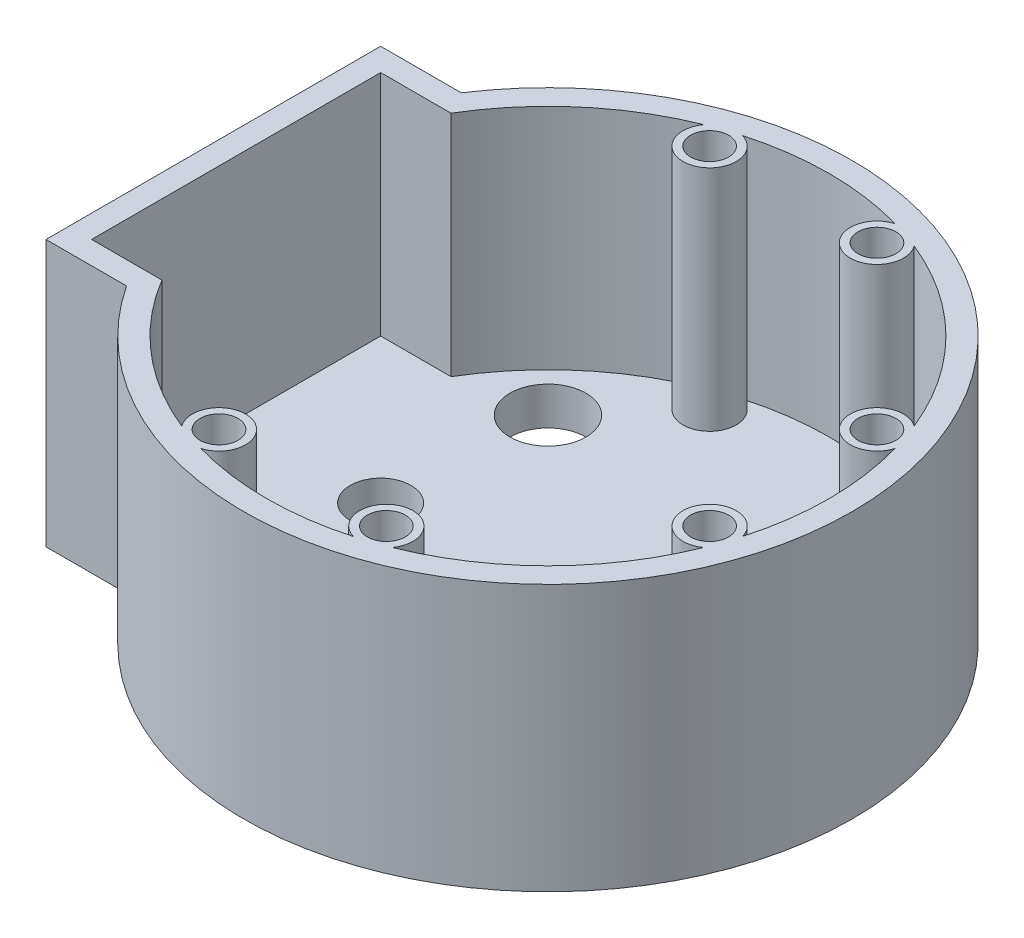
ISO-10303-21;
HEADER;
FILE_DESCRIPTION(('STEP AP214'),'2;1');
FILE_NAME('part.step','',(''),(''),'','','');
FILE_SCHEMA(('AUTOMOTIVE_DESIGN { 1 0 10303 214 1 1 1 1 }'));
ENDSEC;
DATA;
#1=APPLICATION_CONTEXT('core data for automotive mechanical design processes');
#2=APPLICATION_PROTOCOL_DEFINITION('international standard','automotive_design',2000,#1);
#3=PRODUCT_CONTEXT('',#1,'mechanical');
#4=PRODUCT('Part','Part','',(#3));
#5=PRODUCT_RELATED_PRODUCT_CATEGORY('part','',(#4));
#6=PRODUCT_DEFINITION_FORMATION('','',#4);
#7=PRODUCT_DEFINITION_CONTEXT('part definition',#1,'design');
#8=PRODUCT_DEFINITION('design','',#6,#7);
#9=PRODUCT_DEFINITION_SHAPE('','',#8);
#10=(LENGTH_UNIT() NAMED_UNIT(*) SI_UNIT(.MILLI.,.METRE.));
#11=(NAMED_UNIT(*) PLANE_ANGLE_UNIT() SI_UNIT($,.RADIAN.));
#12=(NAMED_UNIT(*) SI_UNIT($,.STERADIAN.) SOLID_ANGLE_UNIT());
#13=UNCERTAINTY_MEASURE_WITH_UNIT(LENGTH_MEASURE(1.E-05),#10,'distance_accuracy_value','');
#14=(GEOMETRIC_REPRESENTATION_CONTEXT(3) GLOBAL_UNCERTAINTY_ASSIGNED_CONTEXT((#13)) GLOBAL_UNIT_ASSIGNED_CONTEXT((#10,
#11,#12)) REPRESENTATION_CONTEXT('',''));
#15=CARTESIAN_POINT('',(0.,0.,0.));
#16=DIRECTION('',(0.,0.,1.));
#17=DIRECTION('',(1.,0.,0.));
#18=AXIS2_PLACEMENT_3D('',#15,#16,#17);
#19=CARTESIAN_POINT('',(-0.00174650833745238,35.,-0.00127364755154764));
#20=DIRECTION('',(0.,-1.,0.));
#21=DIRECTION('',(0.,0.,-1.));
#22=AXIS2_PLACEMENT_3D('',#19,#20,#21);
#23=CYLINDRICAL_SURFACE('',#22,37.);
#24=DIRECTION('',(0.,-1.,0.));
#25=VECTOR('',#24,1.);
#26=CARTESIAN_POINT('',(-10.0315949007935,35.,35.6133601596961));
#27=LINE('',#26,#25);
#28=CARTESIAN_POINT('',(-10.0315949007935,35.,35.6133601596961));
#29=VERTEX_POINT('',#28);
#30=CARTESIAN_POINT('',(-10.0315949007935,5.,35.6133601596961));
#31=VERTEX_POINT('',#30);
#32=EDGE_CURVE('E59',#29,#31,#27,.T.);
#33=ORIENTED_EDGE('',*,*,#32,.F.);
#34=CARTESIAN_POINT('',(-0.00174650833745238,35.,-0.00127364755154764));
#35=DIRECTION('',(0.,1.,0.));
#36=DIRECTION('',(0.,0.,1.));
#37=AXIS2_PLACEMENT_3D('',#34,#35,#36);
#38=CIRCLE('',#37,37.);
#39=CARTESIAN_POINT('',(10.029868490135,35.,35.6128625980802));
#40=VERTEX_POINT('',#39);
#41=EDGE_CURVE('E760',#40,#29,#38,.F.);
#42=ORIENTED_EDGE('',*,*,#41,.F.);
#43=DIRECTION('',(0.,-1.,0.));
#44=VECTOR('',#43,1.);
#45=CARTESIAN_POINT('',(10.029868490135,35.,35.6128625980802));
#46=LINE('',#45,#44);
#47=CARTESIAN_POINT('',(10.029868490135,5.,35.6128625980802));
#48=VERTEX_POINT('',#47);
#49=EDGE_CURVE('E409',#40,#48,#46,.T.);
#50=ORIENTED_EDGE('',*,*,#49,.T.);
#51=CARTESIAN_POINT('',(-0.00174650833745238,5.,-0.00127364755154764));
#52=DIRECTION('',(0.,1.,0.));
#53=DIRECTION('',(0.,0.,1.));
#54=AXIS2_PLACEMENT_3D('',#51,#52,#53);
#55=CIRCLE('',#54,37.);
#56=EDGE_CURVE('E360',#48,#31,#55,.F.);
#57=ORIENTED_EDGE('',*,*,#56,.T.);
#58=EDGE_LOOP('',(#33,#42,#50,#57));
#59=FACE_BOUND('',#58,.T.);
#60=ADVANCED_FACE('F41',(#59),#23,.F.);
#61=DIRECTION('',(0.,-1.,0.));
#62=VECTOR('',#61,1.);
#63=CARTESIAN_POINT('',(13.8230500895819,35.,34.3189099042035));
#64=LINE('',#63,#62);
#65=CARTESIAN_POINT('',(13.8230500895819,35.,34.3189099042035));
#66=VERTEX_POINT('',#65);
#67=CARTESIAN_POINT('',(13.8230500895819,5.,34.3189099042035));
#68=VERTEX_POINT('',#67);
#69=EDGE_CURVE('E68',#66,#68,#64,.T.);
#70=ORIENTED_EDGE('',*,*,#69,.F.);
#71=CARTESIAN_POINT('',(34.3185092642046,35.,13.8233436602547));
#72=VERTEX_POINT('',#71);
#73=EDGE_CURVE('E758',#72,#66,#38,.F.);
#74=ORIENTED_EDGE('',*,*,#73,.F.);
#75=DIRECTION('',(0.,-1.,0.));
#76=VECTOR('',#75,1.);
#77=CARTESIAN_POINT('',(34.3185092642046,35.,13.8233436602547));
#78=LINE('',#77,#76);
#79=CARTESIAN_POINT('',(34.3185092642046,5.,13.8233436602547));
#80=VERTEX_POINT('',#79);
#81=EDGE_CURVE('E386',#72,#80,#78,.T.);
#82=ORIENTED_EDGE('',*,*,#81,.T.);
#83=EDGE_CURVE('E356',#80,#68,#55,.F.);
#84=ORIENTED_EDGE('',*,*,#83,.T.);
#85=EDGE_LOOP('',(#70,#74,#82,#84));
#86=FACE_BOUND('',#85,.T.);
#87=ADVANCED_FACE('F304',(#86),#23,.F.);
#88=DIRECTION('',(0.,-1.,0.));
#89=VECTOR('',#88,1.);
#90=CARTESIAN_POINT('',(35.6126906991223,35.,10.029272817916));
#91=LINE('',#90,#89);
#92=CARTESIAN_POINT('',(35.6126906991223,35.,10.029272817916));
#93=VERTEX_POINT('',#92);
#94=CARTESIAN_POINT('',(35.6126906991223,5.,10.029272817916));
#95=VERTEX_POINT('',#94);
#96=EDGE_CURVE('E383',#93,#95,#91,.T.);
#97=ORIENTED_EDGE('',*,*,#96,.F.);
#98=CARTESIAN_POINT('',(35.6130536975419,35.,-10.030531162208));
#99=VERTEX_POINT('',#98);
#100=EDGE_CURVE('E215',#99,#93,#38,.F.);
#101=ORIENTED_EDGE('',*,*,#100,.F.);
#102=DIRECTION('',(0.,-1.,0.));
#103=VECTOR('',#102,1.);
#104=CARTESIAN_POINT('',(35.6130536975419,35.,-10.030531162208));
#105=LINE('',#104,#103);
#106=CARTESIAN_POINT('',(35.6130536975419,5.,-10.030531162208));
#107=VERTEX_POINT('',#106);
#108=EDGE_CURVE('E392',#99,#107,#105,.T.);
#109=ORIENTED_EDGE('',*,*,#108,.T.);
#110=EDGE_CURVE('E361',#107,#95,#55,.F.);
#111=ORIENTED_EDGE('',*,*,#110,.T.);
#112=EDGE_LOOP('',(#97,#101,#109,#111));
#113=FACE_BOUND('',#112,.T.);
#114=ADVANCED_FACE('F310',(#113),#23,.F.);
#115=DIRECTION('',(0.,-1.,0.));
#116=VECTOR('',#115,1.);
#117=CARTESIAN_POINT('',(34.3199649593925,35.,-13.8222765751938));
#118=LINE('',#117,#116);
#119=CARTESIAN_POINT('',(34.3199649593925,35.,-13.8222765751938));
#120=VERTEX_POINT('',#119);
#121=CARTESIAN_POINT('',(34.3199649593925,5.,-13.8222765751938));
#122=VERTEX_POINT('',#121);
#123=EDGE_CURVE('E376',#120,#122,#118,.T.);
#124=ORIENTED_EDGE('',*,*,#123,.F.);
#125=CARTESIAN_POINT('',(13.8203963955707,35.,-34.3225260364715));
#126=VERTEX_POINT('',#125);
#127=EDGE_CURVE('E208',#126,#120,#38,.F.);
#128=ORIENTED_EDGE('',*,*,#127,.F.);
#129=DIRECTION('',(0.,-1.,0.));
#130=VECTOR('',#129,1.);
#131=CARTESIAN_POINT('',(13.8203963955707,35.,-34.3225260364715));
#132=LINE('',#131,#130);
#133=CARTESIAN_POINT('',(13.8203963955707,5.,-34.3225260364715));
#134=VERTEX_POINT('',#133);
#135=EDGE_CURVE('E184',#126,#134,#132,.T.);
#136=ORIENTED_EDGE('',*,*,#135,.T.);
#137=EDGE_CURVE('E370',#134,#122,#55,.F.);
#138=ORIENTED_EDGE('',*,*,#137,.T.);
#139=EDGE_LOOP('',(#124,#128,#136,#138));
#140=FACE_BOUND('',#139,.T.);
#141=ADVANCED_FACE('F333',(#140),#23,.F.);
#142=DIRECTION('',(0.,-1.,0.));
#143=VECTOR('',#142,1.);
#144=CARTESIAN_POINT('',(10.0343413005817,35.,-35.614149710735));
#145=LINE('',#144,#143);
#146=CARTESIAN_POINT('',(10.0343413005817,35.,-35.614149710735));
#147=VERTEX_POINT('',#146);
#148=CARTESIAN_POINT('',(10.0343413005817,5.,-35.614149710735));
#149=VERTEX_POINT('',#148);
#150=EDGE_CURVE('E182',#147,#149,#145,.T.);
#151=ORIENTED_EDGE('',*,*,#150,.F.);
#152=CARTESIAN_POINT('',(-10.0360725064105,35.,-35.6146461607578));
#153=VERTEX_POINT('',#152);
#154=EDGE_CURVE('E198',#153,#147,#38,.F.);
#155=ORIENTED_EDGE('',*,*,#154,.F.);
#156=DIRECTION('',(0.,-1.,0.));
#157=VECTOR('',#156,1.);
#158=CARTESIAN_POINT('',(-10.0360725064105,35.,-35.6146461607578));
#159=LINE('',#158,#157);
#160=CARTESIAN_POINT('',(-10.0360725064105,5.,-35.6146461607578));
#161=VERTEX_POINT('',#160);
#162=EDGE_CURVE('E343',#153,#161,#159,.T.);
#163=ORIENTED_EDGE('',*,*,#162,.T.);
#164=EDGE_CURVE('E196',#161,#149,#55,.F.);
#165=ORIENTED_EDGE('',*,*,#164,.T.);
#166=EDGE_LOOP('',(#151,#155,#163,#165));
#167=FACE_BOUND('',#166,.T.);
#168=ADVANCED_FACE('F195',(#167),#23,.F.);
#169=DIRECTION('',(0.,-1.,0.));
#170=VECTOR('',#169,1.);
#171=CARTESIAN_POINT('',(-13.8189270574927,35.,-34.3245241007363));
#172=LINE('',#171,#170);
#173=CARTESIAN_POINT('',(-13.8189270574927,35.,-34.3245241007363));
#174=VERTEX_POINT('',#173);
#175=CARTESIAN_POINT('',(-13.8189270574927,5.,-34.3245241007363));
#176=VERTEX_POINT('',#175);
#177=EDGE_CURVE('E340',#174,#176,#172,.T.);
#178=ORIENTED_EDGE('',*,*,#177,.F.);
#179=CARTESIAN_POINT('',(-31.7490156241964,35.,-19.0041919414671));
#180=VERTEX_POINT('',#179);
#181=EDGE_CURVE('E210',#180,#174,#38,.F.);
#182=ORIENTED_EDGE('',*,*,#181,.F.);
#183=DIRECTION('',(0.,-1.,0.));
#184=VECTOR('',#183,1.);
#185=CARTESIAN_POINT('',(-31.7490156241964,35.,-19.0041919414671));
#186=LINE('',#185,#184);
#187=CARTESIAN_POINT('',(-31.7490156241964,5.,-19.0041919414671));
#188=VERTEX_POINT('',#187);
#189=EDGE_CURVE('E243',#180,#188,#186,.T.);
#190=ORIENTED_EDGE('',*,*,#189,.T.);
#191=EDGE_CURVE('E226',#188,#176,#55,.F.);
#192=ORIENTED_EDGE('',*,*,#191,.T.);
#193=EDGE_LOOP('',(#178,#182,#190,#192));
#194=FACE_BOUND('',#193,.T.);
#195=ADVANCED_FACE('F320',(#194),#23,.F.);
#196=CARTESIAN_POINT('',(-0.0033066817774949,5.,0.));
#197=DIRECTION('',(0.,-1.,0.));
#198=DIRECTION('',(0.,0.,-1.));
#199=AXIS2_PLACEMENT_3D('',#196,#197,#198);
#200=CYLINDRICAL_SURFACE('',#199,39.9928277734256);
#201=CARTESIAN_POINT('',(-0.0033066817774949,0.,0.));
#202=DIRECTION('',(0.,1.,0.));
#203=DIRECTION('',(0.,0.,1.));
#204=AXIS2_PLACEMENT_3D('',#201,#202,#203);
#205=CIRCLE('',#204,39.9928277734256);
#206=CARTESIAN_POINT('',(-33.4029025628556,0.,-21.9975741456996));
#207=VERTEX_POINT('',#206);
#208=CARTESIAN_POINT('',(-33.4029025628556,0.,21.9975741456996));
#209=VERTEX_POINT('',#208);
#210=EDGE_CURVE('E249',#207,#209,#205,.F.);
#211=ORIENTED_EDGE('',*,*,#210,.F.);
#212=DIRECTION('',(0.,-1.,0.));
#213=VECTOR('',#212,1.);
#214=CARTESIAN_POINT('',(-33.4029025628556,5.,-21.9975741456996));
#215=LINE('',#214,#213);
#216=CARTESIAN_POINT('',(-33.4029025628556,35.,-21.9975741456996));
#217=VERTEX_POINT('',#216);
#218=EDGE_CURVE('E11',#217,#207,#215,.T.);
#219=ORIENTED_EDGE('',*,*,#218,.F.);
#220=CARTESIAN_POINT('',(-0.0033066817774949,35.,0.));
#221=DIRECTION('',(0.,1.,0.));
#222=DIRECTION('',(0.,0.,1.));
#223=AXIS2_PLACEMENT_3D('',#220,#221,#222);
#224=CIRCLE('',#223,39.9928277734256);
#225=CARTESIAN_POINT('',(-33.4029025628556,35.,21.9975741456996));
#226=VERTEX_POINT('',#225);
#227=EDGE_CURVE('E461',#226,#217,#224,.T.);
#228=ORIENTED_EDGE('',*,*,#227,.F.);
#229=DIRECTION('',(0.,-1.,0.));
#230=VECTOR('',#229,1.);
#231=CARTESIAN_POINT('',(-33.4029025628556,5.,21.9975741456996));
#232=LINE('',#231,#230);
#233=EDGE_CURVE('E259',#226,#209,#232,.T.);
#234=ORIENTED_EDGE('',*,*,#233,.T.);
#235=EDGE_LOOP('',(#211,#219,#228,#234));
#236=FACE_BOUND('',#235,.T.);
#237=ADVANCED_FACE('F43',(#236),#200,.T.);
#238=CARTESIAN_POINT('',(0.,5.,-21.9975741456996));
#239=DIRECTION('',(0.,0.,-1.));
#240=DIRECTION('',(-1.,0.,0.));
#241=AXIS2_PLACEMENT_3D('',#238,#239,#240);
#242=PLANE('',#241);
#243=DIRECTION('',(1.,0.,0.));
#244=VECTOR('',#243,1.);
#245=CARTESIAN_POINT('',(0.,0.,-21.9975741456996));
#246=LINE('',#245,#244);
#247=CARTESIAN_POINT('',(-43.9951482913991,0.,-21.9975741456996));
#248=VERTEX_POINT('',#247);
#249=EDGE_CURVE('E246',#248,#207,#246,.T.);
#250=ORIENTED_EDGE('',*,*,#249,.F.);
#251=DIRECTION('',(0.,-1.,0.));
#252=VECTOR('',#251,1.);
#253=CARTESIAN_POINT('',(-43.9951482913991,5.,-21.9975741456996));
#254=LINE('',#253,#252);
#255=CARTESIAN_POINT('',(-43.9951482913991,35.,-21.9975741456996));
#256=VERTEX_POINT('',#255);
#257=EDGE_CURVE('E49',#256,#248,#254,.T.);
#258=ORIENTED_EDGE('',*,*,#257,.F.);
#259=DIRECTION('',(-1.,0.,0.));
#260=VECTOR('',#259,1.);
#261=CARTESIAN_POINT('',(0.,35.,-21.9975741456996));
#262=LINE('',#261,#260);
#263=EDGE_CURVE('E463',#217,#256,#262,.T.);
#264=ORIENTED_EDGE('',*,*,#263,.F.);
#265=ORIENTED_EDGE('',*,*,#218,.T.);
#266=EDGE_LOOP('',(#250,#258,#264,#265));
#267=FACE_BOUND('',#266,.T.);
#268=ADVANCED_FACE('F334',(#267),#242,.T.);
#269=CARTESIAN_POINT('',(-43.9951482913991,5.,0.));
#270=DIRECTION('',(-1.,0.,0.));
#271=DIRECTION('',(0.,0.,1.));
#272=AXIS2_PLACEMENT_3D('',#269,#270,#271);
#273=PLANE('',#272);
#274=DIRECTION('',(0.,0.,-1.));
#275=VECTOR('',#274,1.);
#276=CARTESIAN_POINT('',(-43.9951482913991,0.,0.));
#277=LINE('',#276,#275);
#278=CARTESIAN_POINT('',(-43.9951482913991,0.,21.9975741456996));
#279=VERTEX_POINT('',#278);
#280=EDGE_CURVE('E251',#279,#248,#277,.T.);
#281=ORIENTED_EDGE('',*,*,#280,.F.);
#282=DIRECTION('',(0.,-1.,0.));
#283=VECTOR('',#282,1.);
#284=CARTESIAN_POINT('',(-43.9951482913991,5.,21.9975741456996));
#285=LINE('',#284,#283);
#286=CARTESIAN_POINT('',(-43.9951482913991,35.,21.9975741456996));
#287=VERTEX_POINT('',#286);
#288=EDGE_CURVE('E261',#287,#279,#285,.T.);
#289=ORIENTED_EDGE('',*,*,#288,.F.);
#290=DIRECTION('',(0.,0.,1.));
#291=VECTOR('',#290,1.);
#292=CARTESIAN_POINT('',(-43.9951482913991,35.,0.));
#293=LINE('',#292,#291);
#294=EDGE_CURVE('E346',#256,#287,#293,.T.);
#295=ORIENTED_EDGE('',*,*,#294,.F.);
#296=ORIENTED_EDGE('',*,*,#257,.T.);
#297=EDGE_LOOP('',(#281,#289,#295,#296));
#298=FACE_BOUND('',#297,.T.);
#299=ADVANCED_FACE('F477',(#298),#273,.T.);
#300=CARTESIAN_POINT('',(0.,5.,21.9975741456996));
#301=DIRECTION('',(0.,0.,-1.));
#302=DIRECTION('',(-1.,0.,0.));
#303=AXIS2_PLACEMENT_3D('',#300,#301,#302);
#304=PLANE('',#303);
#305=DIRECTION('',(1.,0.,0.));
#306=VECTOR('',#305,1.);
#307=CARTESIAN_POINT('',(0.,0.,21.9975741456996));
#308=LINE('',#307,#306);
#309=EDGE_CURVE('E258',#279,#209,#308,.T.);
#310=ORIENTED_EDGE('',*,*,#309,.T.);
#311=ORIENTED_EDGE('',*,*,#233,.F.);
#312=DIRECTION('',(1.,0.,0.));
#313=VECTOR('',#312,1.);
#314=CARTESIAN_POINT('',(0.,35.,21.9975741456996));
#315=LINE('',#314,#313);
#316=EDGE_CURVE('E231',#287,#226,#315,.T.);
#317=ORIENTED_EDGE('',*,*,#316,.F.);
#318=ORIENTED_EDGE('',*,*,#288,.T.);
#319=EDGE_LOOP('',(#310,#311,#317,#318));
#320=FACE_BOUND('',#319,.T.);
#321=ADVANCED_FACE('F471',(#320),#304,.F.);
#322=CARTESIAN_POINT('',(0.,0.,0.));
#323=DIRECTION('',(0.,1.,0.));
#324=DIRECTION('',(0.,0.,1.));
#325=AXIS2_PLACEMENT_3D('',#322,#323,#324);
#326=PLANE('',#325);
#327=CARTESIAN_POINT('',(-11.,0.,32.25));
#328=DIRECTION('',(0.,1.,0.));
#329=DIRECTION('',(0.,0.,1.));
#330=AXIS2_PLACEMENT_3D('',#327,#328,#329);
#331=CIRCLE('',#330,2.5);
#332=CARTESIAN_POINT('',(-11.,0.,34.75));
#333=VERTEX_POINT('',#332);
#334=EDGE_CURVE('E444',#333,#333,#331,.T.);
#335=ORIENTED_EDGE('',*,*,#334,.T.);
#336=EDGE_LOOP('',(#335));
#337=FACE_BOUND('',#336,.T.);
#338=CARTESIAN_POINT('',(11.,0.,-32.25));
#339=DIRECTION('',(0.,1.,0.));
#340=DIRECTION('',(0.,0.,1.));
#341=AXIS2_PLACEMENT_3D('',#338,#339,#340);
#342=CIRCLE('',#341,2.5);
#343=CARTESIAN_POINT('',(11.,0.,-29.75));
#344=VERTEX_POINT('',#343);
#345=EDGE_CURVE('E439',#344,#344,#342,.T.);
#346=ORIENTED_EDGE('',*,*,#345,.T.);
#347=EDGE_LOOP('',(#346));
#348=FACE_BOUND('',#347,.T.);
#349=CARTESIAN_POINT('',(32.25,0.,11.));
#350=DIRECTION('',(0.,1.,0.));
#351=DIRECTION('',(0.,0.,1.));
#352=AXIS2_PLACEMENT_3D('',#349,#350,#351);
#353=CIRCLE('',#352,2.5);
#354=CARTESIAN_POINT('',(32.25,0.,13.5));
#355=VERTEX_POINT('',#354);
#356=EDGE_CURVE('E440',#355,#355,#353,.T.);
#357=ORIENTED_EDGE('',*,*,#356,.T.);
#358=EDGE_LOOP('',(#357));
#359=FACE_BOUND('',#358,.T.);
#360=CARTESIAN_POINT('',(32.25,0.,-11.));
#361=DIRECTION('',(0.,1.,0.));
#362=DIRECTION('',(0.,0.,1.));
#363=AXIS2_PLACEMENT_3D('',#360,#361,#362);
#364=CIRCLE('',#363,2.5);
#365=CARTESIAN_POINT('',(32.25,0.,-8.5));
#366=VERTEX_POINT('',#365);
#367=EDGE_CURVE('E432',#366,#366,#364,.T.);
#368=ORIENTED_EDGE('',*,*,#367,.T.);
#369=EDGE_LOOP('',(#368));
#370=FACE_BOUND('',#369,.T.);
#371=CARTESIAN_POINT('',(11.,0.,32.25));
#372=DIRECTION('',(0.,1.,0.));
#373=DIRECTION('',(0.,0.,1.));
#374=AXIS2_PLACEMENT_3D('',#371,#372,#373);
#375=CIRCLE('',#374,2.5);
#376=CARTESIAN_POINT('',(11.,0.,34.75));
#377=VERTEX_POINT('',#376);
#378=EDGE_CURVE('E431',#377,#377,#375,.T.);
#379=ORIENTED_EDGE('',*,*,#378,.T.);
#380=EDGE_LOOP('',(#379));
#381=FACE_BOUND('',#380,.T.);
#382=CARTESIAN_POINT('',(-11.,0.,-32.25));
#383=DIRECTION('',(0.,1.,0.));
#384=DIRECTION('',(0.,0.,1.));
#385=AXIS2_PLACEMENT_3D('',#382,#383,#384);
#386=CIRCLE('',#385,2.5);
#387=CARTESIAN_POINT('',(-11.,0.,-29.75));
#388=VERTEX_POINT('',#387);
#389=EDGE_CURVE('E339',#388,#388,#386,.T.);
#390=ORIENTED_EDGE('',*,*,#389,.T.);
#391=EDGE_LOOP('',(#390));
#392=FACE_BOUND('',#391,.T.);
#393=CARTESIAN_POINT('',(-21.,0.,21.));
#394=DIRECTION('',(0.,1.,0.));
#395=DIRECTION('',(0.,0.,1.));
#396=AXIS2_PLACEMENT_3D('',#393,#394,#395);
#397=CIRCLE('',#396,5.);
#398=CARTESIAN_POINT('',(-21.,0.,26.));
#399=VERTEX_POINT('',#398);
#400=EDGE_CURVE('E44',#399,#399,#397,.T.);
#401=ORIENTED_EDGE('',*,*,#400,.T.);
#402=EDGE_LOOP('',(#401));
#403=FACE_BOUND('',#402,.T.);
#404=CARTESIAN_POINT('',(21.,0.,21.));
#405=DIRECTION('',(0.,1.,0.));
#406=DIRECTION('',(0.,0.,1.));
#407=AXIS2_PLACEMENT_3D('',#404,#405,#406);
#408=CIRCLE('',#407,5.);
#409=CARTESIAN_POINT('',(21.,0.,26.));
#410=VERTEX_POINT('',#409);
#411=EDGE_CURVE('E272',#410,#410,#408,.T.);
#412=ORIENTED_EDGE('',*,*,#411,.T.);
#413=EDGE_LOOP('',(#412));
#414=FACE_BOUND('',#413,.T.);
#415=CARTESIAN_POINT('',(21.,0.,-21.));
#416=DIRECTION('',(0.,1.,0.));
#417=DIRECTION('',(0.,0.,1.));
#418=AXIS2_PLACEMENT_3D('',#415,#416,#417);
#419=CIRCLE('',#418,5.);
#420=CARTESIAN_POINT('',(21.,0.,-16.));
#421=VERTEX_POINT('',#420);
#422=EDGE_CURVE('E271',#421,#421,#419,.T.);
#423=ORIENTED_EDGE('',*,*,#422,.T.);
#424=EDGE_LOOP('',(#423));
#425=FACE_BOUND('',#424,.T.);
#426=CARTESIAN_POINT('',(-21.,0.,-21.));
#427=DIRECTION('',(0.,1.,0.));
#428=DIRECTION('',(0.,0.,1.));
#429=AXIS2_PLACEMENT_3D('',#426,#427,#428);
#430=CIRCLE('',#429,5.);
#431=CARTESIAN_POINT('',(-21.,0.,-16.));
#432=VERTEX_POINT('',#431);
#433=EDGE_CURVE('E270',#432,#432,#430,.T.);
#434=ORIENTED_EDGE('',*,*,#433,.T.);
#435=EDGE_LOOP('',(#434));
#436=FACE_BOUND('',#435,.T.);
#437=CARTESIAN_POINT('',(-22.,0.,0.));
#438=DIRECTION('',(0.,1.,0.));
#439=DIRECTION('',(0.,0.,1.));
#440=AXIS2_PLACEMENT_3D('',#437,#438,#439);
#441=CIRCLE('',#440,4.);
#442=CARTESIAN_POINT('',(-22.,0.,4.));
#443=VERTEX_POINT('',#442);
#444=EDGE_CURVE('E262',#443,#443,#441,.T.);
#445=ORIENTED_EDGE('',*,*,#444,.T.);
#446=EDGE_LOOP('',(#445));
#447=FACE_BOUND('',#446,.T.);
#448=ORIENTED_EDGE('',*,*,#210,.T.);
#449=ORIENTED_EDGE('',*,*,#309,.F.);
#450=ORIENTED_EDGE('',*,*,#280,.T.);
#451=ORIENTED_EDGE('',*,*,#249,.T.);
#452=EDGE_LOOP('',(#448,#449,#450,#451));
#453=FACE_BOUND('',#452,.T.);
#454=ADVANCED_FACE('F278',(#337,#348,#359,#370,#381,#392,#403,#414,#425,#436,#447,#453),#326,.F.);
#455=CARTESIAN_POINT('',(0.,35.,-19.0041919414671));
#456=DIRECTION('',(0.,0.,-1.));
#457=DIRECTION('',(-1.,0.,0.));
#458=AXIS2_PLACEMENT_3D('',#455,#456,#457);
#459=PLANE('',#458);
#460=DIRECTION('',(1.,0.,0.));
#461=VECTOR('',#460,1.);
#462=CARTESIAN_POINT('',(0.,5.,-19.0041919414671));
#463=LINE('',#462,#461);
#464=CARTESIAN_POINT('',(-41.,5.,-19.0041919414671));
#465=VERTEX_POINT('',#464);
#466=EDGE_CURVE('E225',#465,#188,#463,.T.);
#467=ORIENTED_EDGE('',*,*,#466,.T.);
#468=ORIENTED_EDGE('',*,*,#189,.F.);
#469=DIRECTION('',(1.,0.,0.));
#470=VECTOR('',#469,1.);
#471=CARTESIAN_POINT('',(0.,35.,-19.0041919414671));
#472=LINE('',#471,#470);
#473=CARTESIAN_POINT('',(-41.,35.,-19.0041919414671));
#474=VERTEX_POINT('',#473);
#475=EDGE_CURVE('E214',#474,#180,#472,.T.);
#476=ORIENTED_EDGE('',*,*,#475,.F.);
#477=DIRECTION('',(0.,-1.,0.));
#478=VECTOR('',#477,1.);
#479=CARTESIAN_POINT('',(-41.,35.,-19.0041919414671));
#480=LINE('',#479,#478);
#481=EDGE_CURVE('E222',#474,#465,#480,.T.);
#482=ORIENTED_EDGE('',*,*,#481,.T.);
#483=EDGE_LOOP('',(#467,#468,#476,#482));
#484=FACE_BOUND('',#483,.T.);
#485=ADVANCED_FACE('F312',(#484),#459,.F.);
#486=CARTESIAN_POINT('',(-13.8215858834969,35.,34.3209063479673));
#487=VERTEX_POINT('',#486);
#488=CARTESIAN_POINT('',(-31.75,35.,19.));
#489=VERTEX_POINT('',#488);
#490=EDGE_CURVE('E211',#487,#489,#38,.F.);
#491=ORIENTED_EDGE('',*,*,#490,.F.);
#492=DIRECTION('',(0.,-1.,0.));
#493=VECTOR('',#492,1.);
#494=CARTESIAN_POINT('',(-13.8215858834969,35.,34.3209063479673));
#495=LINE('',#494,#493);
#496=CARTESIAN_POINT('',(-13.8215858834969,5.,34.3209063479673));
#497=VERTEX_POINT('',#496);
#498=EDGE_CURVE('E420',#487,#497,#495,.T.);
#499=ORIENTED_EDGE('',*,*,#498,.T.);
#500=CARTESIAN_POINT('',(-31.75,5.,19.));
#501=VERTEX_POINT('',#500);
#502=EDGE_CURVE('E223',#497,#501,#55,.F.);
#503=ORIENTED_EDGE('',*,*,#502,.T.);
#504=DIRECTION('',(0.,-1.,0.));
#505=VECTOR('',#504,1.);
#506=CARTESIAN_POINT('',(-31.75,35.,19.));
#507=LINE('',#506,#505);
#508=EDGE_CURVE('E241',#489,#501,#507,.T.);
#509=ORIENTED_EDGE('',*,*,#508,.F.);
#510=EDGE_LOOP('',(#491,#499,#503,#509));
#511=FACE_BOUND('',#510,.T.);
#512=ADVANCED_FACE('F301',(#511),#23,.F.);
#513=CARTESIAN_POINT('',(0.,35.,19.));
#514=DIRECTION('',(0.,0.,-1.));
#515=DIRECTION('',(-1.,0.,0.));
#516=AXIS2_PLACEMENT_3D('',#513,#514,#515);
#517=PLANE('',#516);
#518=DIRECTION('',(1.,0.,0.));
#519=VECTOR('',#518,1.);
#520=CARTESIAN_POINT('',(0.,5.,19.));
#521=LINE('',#520,#519);
#522=CARTESIAN_POINT('',(-41.,5.,19.));
#523=VERTEX_POINT('',#522);
#524=EDGE_CURVE('E228',#523,#501,#521,.T.);
#525=ORIENTED_EDGE('',*,*,#524,.F.);
#526=DIRECTION('',(0.,-1.,0.));
#527=VECTOR('',#526,1.);
#528=CARTESIAN_POINT('',(-41.,35.,19.));
#529=LINE('',#528,#527);
#530=CARTESIAN_POINT('',(-41.,35.,19.));
#531=VERTEX_POINT('',#530);
#532=EDGE_CURVE('E236',#531,#523,#529,.T.);
#533=ORIENTED_EDGE('',*,*,#532,.F.);
#534=DIRECTION('',(1.,0.,0.));
#535=VECTOR('',#534,1.);
#536=CARTESIAN_POINT('',(0.,35.,19.));
#537=LINE('',#536,#535);
#538=EDGE_CURVE('E209',#531,#489,#537,.T.);
#539=ORIENTED_EDGE('',*,*,#538,.T.);
#540=ORIENTED_EDGE('',*,*,#508,.T.);
#541=EDGE_LOOP('',(#525,#533,#539,#540));
#542=FACE_BOUND('',#541,.T.);
#543=ADVANCED_FACE('F314',(#542),#517,.T.);
#544=CARTESIAN_POINT('',(-41.,35.,0.));
#545=DIRECTION('',(-1.,0.,0.));
#546=DIRECTION('',(0.,0.,1.));
#547=AXIS2_PLACEMENT_3D('',#544,#545,#546);
#548=PLANE('',#547);
#549=DIRECTION('',(0.,0.,-1.));
#550=VECTOR('',#549,1.);
#551=CARTESIAN_POINT('',(-41.,5.,0.));
#552=LINE('',#551,#550);
#553=EDGE_CURVE('E234',#523,#465,#552,.T.);
#554=ORIENTED_EDGE('',*,*,#553,.T.);
#555=ORIENTED_EDGE('',*,*,#481,.F.);
#556=DIRECTION('',(0.,0.,-1.));
#557=VECTOR('',#556,1.);
#558=CARTESIAN_POINT('',(-41.,35.,0.));
#559=LINE('',#558,#557);
#560=EDGE_CURVE('E218',#531,#474,#559,.T.);
#561=ORIENTED_EDGE('',*,*,#560,.F.);
#562=ORIENTED_EDGE('',*,*,#532,.T.);
#563=EDGE_LOOP('',(#554,#555,#561,#562));
#564=FACE_BOUND('',#563,.T.);
#565=ADVANCED_FACE('F323',(#564),#548,.F.);
#566=CARTESIAN_POINT('',(0.,35.,0.));
#567=DIRECTION('',(0.,1.,0.));
#568=DIRECTION('',(0.,0.,1.));
#569=AXIS2_PLACEMENT_3D('',#566,#567,#568);
#570=PLANE('',#569);
#571=ORIENTED_EDGE('',*,*,#316,.T.);
#572=ORIENTED_EDGE('',*,*,#227,.T.);
#573=ORIENTED_EDGE('',*,*,#263,.T.);
#574=ORIENTED_EDGE('',*,*,#294,.T.);
#575=EDGE_LOOP('',(#571,#572,#573,#574));
#576=FACE_BOUND('',#575,.T.);
#577=ORIENTED_EDGE('',*,*,#475,.T.);
#578=ORIENTED_EDGE('',*,*,#181,.T.);
#579=CARTESIAN_POINT('',(-11.,35.,-32.25));
#580=DIRECTION('',(0.,1.,0.));
#581=DIRECTION('',(0.,0.,1.));
#582=AXIS2_PLACEMENT_3D('',#579,#580,#581);
#583=CIRCLE('',#582,3.5);
#584=EDGE_CURVE('E202',#174,#153,#583,.T.);
#585=ORIENTED_EDGE('',*,*,#584,.T.);
#586=ORIENTED_EDGE('',*,*,#154,.T.);
#587=CARTESIAN_POINT('',(11.,35.,-32.25));
#588=DIRECTION('',(0.,1.,0.));
#589=DIRECTION('',(0.,0.,1.));
#590=AXIS2_PLACEMENT_3D('',#587,#588,#589);
#591=CIRCLE('',#590,3.5);
#592=EDGE_CURVE('E177',#147,#126,#591,.T.);
#593=ORIENTED_EDGE('',*,*,#592,.T.);
#594=ORIENTED_EDGE('',*,*,#127,.T.);
#595=CARTESIAN_POINT('',(32.25,35.,-11.));
#596=DIRECTION('',(0.,1.,0.));
#597=DIRECTION('',(0.,0.,1.));
#598=AXIS2_PLACEMENT_3D('',#595,#596,#597);
#599=CIRCLE('',#598,3.5);
#600=EDGE_CURVE('E390',#120,#99,#599,.T.);
#601=ORIENTED_EDGE('',*,*,#600,.T.);
#602=ORIENTED_EDGE('',*,*,#100,.T.);
#603=CARTESIAN_POINT('',(32.25,35.,11.));
#604=DIRECTION('',(0.,1.,0.));
#605=DIRECTION('',(0.,0.,1.));
#606=AXIS2_PLACEMENT_3D('',#603,#604,#605);
#607=CIRCLE('',#606,3.5);
#608=EDGE_CURVE('E400',#93,#72,#607,.T.);
#609=ORIENTED_EDGE('',*,*,#608,.T.);
#610=ORIENTED_EDGE('',*,*,#73,.T.);
#611=CARTESIAN_POINT('',(11.,35.,32.25));
#612=DIRECTION('',(0.,1.,0.));
#613=DIRECTION('',(0.,0.,1.));
#614=AXIS2_PLACEMENT_3D('',#611,#612,#613);
#615=CIRCLE('',#614,3.5);
#616=EDGE_CURVE('E410',#66,#40,#615,.T.);
#617=ORIENTED_EDGE('',*,*,#616,.T.);
#618=ORIENTED_EDGE('',*,*,#41,.T.);
#619=CARTESIAN_POINT('',(-11.,35.,32.25));
#620=DIRECTION('',(0.,1.,0.));
#621=DIRECTION('',(0.,0.,1.));
#622=AXIS2_PLACEMENT_3D('',#619,#620,#621);
#623=CIRCLE('',#622,3.5);
#624=EDGE_CURVE('E417',#29,#487,#623,.T.);
#625=ORIENTED_EDGE('',*,*,#624,.T.);
#626=ORIENTED_EDGE('',*,*,#490,.T.);
#627=ORIENTED_EDGE('',*,*,#538,.F.);
#628=ORIENTED_EDGE('',*,*,#560,.T.);
#629=EDGE_LOOP('',(#577,#578,#585,#586,#593,#594,#601,#602,#609,#610,#617,#618,#625,#626,#627,#628));
#630=FACE_BOUND('',#629,.T.);
#631=CARTESIAN_POINT('',(-11.,35.,-32.25));
#632=DIRECTION('',(0.,1.,0.));
#633=DIRECTION('',(0.,0.,1.));
#634=AXIS2_PLACEMENT_3D('',#631,#632,#633);
#635=CIRCLE('',#634,2.5);
#636=CARTESIAN_POINT('',(-11.,35.,-29.75));
#637=VERTEX_POINT('',#636);
#638=EDGE_CURVE('E421',#637,#637,#635,.F.);
#639=ORIENTED_EDGE('',*,*,#638,.T.);
#640=EDGE_LOOP('',(#639));
#641=FACE_BOUND('',#640,.T.);
#642=CARTESIAN_POINT('',(11.,35.,-32.25));
#643=DIRECTION('',(0.,1.,0.));
#644=DIRECTION('',(0.,0.,1.));
#645=AXIS2_PLACEMENT_3D('',#642,#643,#644);
#646=CIRCLE('',#645,2.5);
#647=CARTESIAN_POINT('',(11.,35.,-29.75));
#648=VERTEX_POINT('',#647);
#649=EDGE_CURVE('E188',#648,#648,#646,.F.);
#650=ORIENTED_EDGE('',*,*,#649,.T.);
#651=EDGE_LOOP('',(#650));
#652=FACE_BOUND('',#651,.T.);
#653=CARTESIAN_POINT('',(32.25,35.,-11.));
#654=DIRECTION('',(0.,1.,0.));
#655=DIRECTION('',(0.,0.,1.));
#656=AXIS2_PLACEMENT_3D('',#653,#654,#655);
#657=CIRCLE('',#656,2.5);
#658=CARTESIAN_POINT('',(32.25,35.,-8.5));
#659=VERTEX_POINT('',#658);
#660=EDGE_CURVE('E382',#659,#659,#657,.F.);
#661=ORIENTED_EDGE('',*,*,#660,.T.);
#662=EDGE_LOOP('',(#661));
#663=FACE_BOUND('',#662,.T.);
#664=CARTESIAN_POINT('',(32.25,35.,11.));
#665=DIRECTION('',(0.,1.,0.));
#666=DIRECTION('',(0.,0.,1.));
#667=AXIS2_PLACEMENT_3D('',#664,#665,#666);
#668=CIRCLE('',#667,2.5);
#669=CARTESIAN_POINT('',(32.25,35.,13.5));
#670=VERTEX_POINT('',#669);
#671=EDGE_CURVE('E398',#670,#670,#668,.F.);
#672=ORIENTED_EDGE('',*,*,#671,.T.);
#673=EDGE_LOOP('',(#672));
#674=FACE_BOUND('',#673,.T.);
#675=CARTESIAN_POINT('',(11.,35.,32.25));
#676=DIRECTION('',(0.,1.,0.));
#677=DIRECTION('',(0.,0.,1.));
#678=AXIS2_PLACEMENT_3D('',#675,#676,#677);
#679=CIRCLE('',#678,2.5);
#680=CARTESIAN_POINT('',(11.,35.,34.75));
#681=VERTEX_POINT('',#680);
#682=EDGE_CURVE('E404',#681,#681,#679,.F.);
#683=ORIENTED_EDGE('',*,*,#682,.T.);
#684=EDGE_LOOP('',(#683));
#685=FACE_BOUND('',#684,.T.);
#686=CARTESIAN_POINT('',(-11.,35.,32.25));
#687=DIRECTION('',(0.,1.,0.));
#688=DIRECTION('',(0.,0.,1.));
#689=AXIS2_PLACEMENT_3D('',#686,#687,#688);
#690=CIRCLE('',#689,2.5);
#691=CARTESIAN_POINT('',(-11.,35.,34.75));
#692=VERTEX_POINT('',#691);
#693=EDGE_CURVE('E415',#692,#692,#690,.F.);
#694=ORIENTED_EDGE('',*,*,#693,.T.);
#695=EDGE_LOOP('',(#694));
#696=FACE_BOUND('',#695,.T.);
#697=ADVANCED_FACE('F205',(#576,#630,#641,#652,#663,#674,#685,#696),#570,.T.);
#698=CARTESIAN_POINT('',(0.,5.,0.));
#699=DIRECTION('',(0.,1.,0.));
#700=DIRECTION('',(0.,0.,1.));
#701=AXIS2_PLACEMENT_3D('',#698,#699,#700);
#702=PLANE('',#701);
#703=CARTESIAN_POINT('',(-21.,5.,21.));
#704=DIRECTION('',(0.,1.,0.));
#705=DIRECTION('',(0.,0.,1.));
#706=AXIS2_PLACEMENT_3D('',#703,#704,#705);
#707=CIRCLE('',#706,5.);
#708=CARTESIAN_POINT('',(-21.,5.,26.));
#709=VERTEX_POINT('',#708);
#710=EDGE_CURVE('E446',#709,#709,#707,.T.);
#711=ORIENTED_EDGE('',*,*,#710,.F.);
#712=EDGE_LOOP('',(#711));
#713=FACE_BOUND('',#712,.T.);
#714=CARTESIAN_POINT('',(21.,5.,21.));
#715=DIRECTION('',(0.,1.,0.));
#716=DIRECTION('',(0.,0.,1.));
#717=AXIS2_PLACEMENT_3D('',#714,#715,#716);
#718=CIRCLE('',#717,5.);
#719=CARTESIAN_POINT('',(21.,5.,26.));
#720=VERTEX_POINT('',#719);
#721=EDGE_CURVE('E452',#720,#720,#718,.T.);
#722=ORIENTED_EDGE('',*,*,#721,.F.);
#723=EDGE_LOOP('',(#722));
#724=FACE_BOUND('',#723,.T.);
#725=CARTESIAN_POINT('',(21.,5.,-21.));
#726=DIRECTION('',(0.,1.,0.));
#727=DIRECTION('',(0.,0.,1.));
#728=AXIS2_PLACEMENT_3D('',#725,#726,#727);
#729=CIRCLE('',#728,5.);
#730=CARTESIAN_POINT('',(21.,5.,-16.));
#731=VERTEX_POINT('',#730);
#732=EDGE_CURVE('E449',#731,#731,#729,.T.);
#733=ORIENTED_EDGE('',*,*,#732,.F.);
#734=EDGE_LOOP('',(#733));
#735=FACE_BOUND('',#734,.T.);
#736=CARTESIAN_POINT('',(-21.,5.,-21.));
#737=DIRECTION('',(0.,1.,0.));
#738=DIRECTION('',(0.,0.,1.));
#739=AXIS2_PLACEMENT_3D('',#736,#737,#738);
#740=CIRCLE('',#739,5.);
#741=CARTESIAN_POINT('',(-21.,5.,-16.));
#742=VERTEX_POINT('',#741);
#743=EDGE_CURVE('E450',#742,#742,#740,.T.);
#744=ORIENTED_EDGE('',*,*,#743,.F.);
#745=EDGE_LOOP('',(#744));
#746=FACE_BOUND('',#745,.T.);
#747=CARTESIAN_POINT('',(-22.,5.,0.));
#748=DIRECTION('',(0.,1.,0.));
#749=DIRECTION('',(0.,0.,1.));
#750=AXIS2_PLACEMENT_3D('',#747,#748,#749);
#751=CIRCLE('',#750,4.);
#752=CARTESIAN_POINT('',(-22.,5.,4.));
#753=VERTEX_POINT('',#752);
#754=EDGE_CURVE('E268',#753,#753,#751,.T.);
#755=ORIENTED_EDGE('',*,*,#754,.F.);
#756=EDGE_LOOP('',(#755));
#757=FACE_BOUND('',#756,.T.);
#758=ORIENTED_EDGE('',*,*,#502,.F.);
#759=CARTESIAN_POINT('',(-11.,5.,32.25));
#760=DIRECTION('',(0.,1.,0.));
#761=DIRECTION('',(0.,0.,1.));
#762=AXIS2_PLACEMENT_3D('',#759,#760,#761);
#763=CIRCLE('',#762,3.5);
#764=EDGE_CURVE('E358',#31,#497,#763,.T.);
#765=ORIENTED_EDGE('',*,*,#764,.F.);
#766=ORIENTED_EDGE('',*,*,#56,.F.);
#767=CARTESIAN_POINT('',(11.,5.,32.25));
#768=DIRECTION('',(0.,1.,0.));
#769=DIRECTION('',(0.,0.,1.));
#770=AXIS2_PLACEMENT_3D('',#767,#768,#769);
#771=CIRCLE('',#770,3.5);
#772=EDGE_CURVE('E407',#68,#48,#771,.T.);
#773=ORIENTED_EDGE('',*,*,#772,.F.);
#774=ORIENTED_EDGE('',*,*,#83,.F.);
#775=CARTESIAN_POINT('',(32.25,5.,11.));
#776=DIRECTION('',(0.,1.,0.));
#777=DIRECTION('',(0.,0.,1.));
#778=AXIS2_PLACEMENT_3D('',#775,#776,#777);
#779=CIRCLE('',#778,3.5);
#780=EDGE_CURVE('E396',#95,#80,#779,.T.);
#781=ORIENTED_EDGE('',*,*,#780,.F.);
#782=ORIENTED_EDGE('',*,*,#110,.F.);
#783=CARTESIAN_POINT('',(32.25,5.,-11.));
#784=DIRECTION('',(0.,1.,0.));
#785=DIRECTION('',(0.,0.,1.));
#786=AXIS2_PLACEMENT_3D('',#783,#784,#785);
#787=CIRCLE('',#786,3.5);
#788=EDGE_CURVE('E377',#122,#107,#787,.T.);
#789=ORIENTED_EDGE('',*,*,#788,.F.);
#790=ORIENTED_EDGE('',*,*,#137,.F.);
#791=CARTESIAN_POINT('',(11.,5.,-32.25));
#792=DIRECTION('',(0.,1.,0.));
#793=DIRECTION('',(0.,0.,1.));
#794=AXIS2_PLACEMENT_3D('',#791,#792,#793);
#795=CIRCLE('',#794,3.5);
#796=EDGE_CURVE('E378',#149,#134,#795,.T.);
#797=ORIENTED_EDGE('',*,*,#796,.F.);
#798=ORIENTED_EDGE('',*,*,#164,.F.);
#799=CARTESIAN_POINT('',(-11.,5.,-32.25));
#800=DIRECTION('',(0.,1.,0.));
#801=DIRECTION('',(0.,0.,1.));
#802=AXIS2_PLACEMENT_3D('',#799,#800,#801);
#803=CIRCLE('',#802,3.5);
#804=EDGE_CURVE('E200',#176,#161,#803,.T.);
#805=ORIENTED_EDGE('',*,*,#804,.F.);
#806=ORIENTED_EDGE('',*,*,#191,.F.);
#807=ORIENTED_EDGE('',*,*,#466,.F.);
#808=ORIENTED_EDGE('',*,*,#553,.F.);
#809=ORIENTED_EDGE('',*,*,#524,.T.);
#810=EDGE_LOOP('',(#758,#765,#766,#773,#774,#781,#782,#789,#790,#797,#798,#805,#806,#807,#808,#809));
#811=FACE_BOUND('',#810,.T.);
#812=ADVANCED_FACE('F351',(#713,#724,#735,#746,#757,#811),#702,.T.);
#813=CARTESIAN_POINT('',(-22.,-25.,0.));
#814=DIRECTION('',(0.,1.,0.));
#815=DIRECTION('',(0.,0.,1.));
#816=AXIS2_PLACEMENT_3D('',#813,#814,#815);
#817=CYLINDRICAL_SURFACE('',#816,4.);
#818=ORIENTED_EDGE('',*,*,#754,.T.);
#819=EDGE_LOOP('',(#818));
#820=FACE_BOUND('',#819,.T.);
#821=ORIENTED_EDGE('',*,*,#444,.F.);
#822=EDGE_LOOP('',(#821));
#823=FACE_BOUND('',#822,.T.);
#824=ADVANCED_FACE('F530',(#820,#823),#817,.F.);
#825=CARTESIAN_POINT('',(-21.,-25.,-21.));
#826=DIRECTION('',(0.,1.,0.));
#827=DIRECTION('',(0.,0.,1.));
#828=AXIS2_PLACEMENT_3D('',#825,#826,#827);
#829=CYLINDRICAL_SURFACE('',#828,5.);
#830=ORIENTED_EDGE('',*,*,#743,.T.);
#831=EDGE_LOOP('',(#830));
#832=FACE_BOUND('',#831,.T.);
#833=ORIENTED_EDGE('',*,*,#433,.F.);
#834=EDGE_LOOP('',(#833));
#835=FACE_BOUND('',#834,.T.);
#836=ADVANCED_FACE('F531',(#832,#835),#829,.F.);
#837=CARTESIAN_POINT('',(21.,-25.,-21.));
#838=DIRECTION('',(0.,1.,0.));
#839=DIRECTION('',(0.,0.,1.));
#840=AXIS2_PLACEMENT_3D('',#837,#838,#839);
#841=CYLINDRICAL_SURFACE('',#840,5.);
#842=ORIENTED_EDGE('',*,*,#732,.T.);
#843=EDGE_LOOP('',(#842));
#844=FACE_BOUND('',#843,.T.);
#845=ORIENTED_EDGE('',*,*,#422,.F.);
#846=EDGE_LOOP('',(#845));
#847=FACE_BOUND('',#846,.T.);
#848=ADVANCED_FACE('F296',(#844,#847),#841,.F.);
#849=CARTESIAN_POINT('',(21.,-25.,21.));
#850=DIRECTION('',(0.,1.,0.));
#851=DIRECTION('',(0.,0.,1.));
#852=AXIS2_PLACEMENT_3D('',#849,#850,#851);
#853=CYLINDRICAL_SURFACE('',#852,5.);
#854=ORIENTED_EDGE('',*,*,#721,.T.);
#855=EDGE_LOOP('',(#854));
#856=FACE_BOUND('',#855,.T.);
#857=ORIENTED_EDGE('',*,*,#411,.F.);
#858=EDGE_LOOP('',(#857));
#859=FACE_BOUND('',#858,.T.);
#860=ADVANCED_FACE('F284',(#856,#859),#853,.F.);
#861=CARTESIAN_POINT('',(-21.,-25.,21.));
#862=DIRECTION('',(0.,1.,0.));
#863=DIRECTION('',(0.,0.,1.));
#864=AXIS2_PLACEMENT_3D('',#861,#862,#863);
#865=CYLINDRICAL_SURFACE('',#864,5.);
#866=ORIENTED_EDGE('',*,*,#710,.T.);
#867=EDGE_LOOP('',(#866));
#868=FACE_BOUND('',#867,.T.);
#869=ORIENTED_EDGE('',*,*,#400,.F.);
#870=EDGE_LOOP('',(#869));
#871=FACE_BOUND('',#870,.T.);
#872=ADVANCED_FACE('F285',(#868,#871),#865,.F.);
#873=CARTESIAN_POINT('',(-11.,-25.,-32.25));
#874=DIRECTION('',(0.,1.,0.));
#875=DIRECTION('',(0.,0.,1.));
#876=AXIS2_PLACEMENT_3D('',#873,#874,#875);
#877=CYLINDRICAL_SURFACE('',#876,2.5);
#878=ORIENTED_EDGE('',*,*,#389,.F.);
#879=EDGE_LOOP('',(#878));
#880=FACE_BOUND('',#879,.T.);
#881=ORIENTED_EDGE('',*,*,#638,.F.);
#882=EDGE_LOOP('',(#881));
#883=FACE_BOUND('',#882,.T.);
#884=ADVANCED_FACE('F283',(#880,#883),#877,.F.);
#885=CARTESIAN_POINT('',(11.,-25.,32.25));
#886=DIRECTION('',(0.,1.,0.));
#887=DIRECTION('',(0.,0.,1.));
#888=AXIS2_PLACEMENT_3D('',#885,#886,#887);
#889=CYLINDRICAL_SURFACE('',#888,2.5);
#890=ORIENTED_EDGE('',*,*,#378,.F.);
#891=EDGE_LOOP('',(#890));
#892=FACE_BOUND('',#891,.T.);
#893=ORIENTED_EDGE('',*,*,#682,.F.);
#894=EDGE_LOOP('',(#893));
#895=FACE_BOUND('',#894,.T.);
#896=ADVANCED_FACE('F291',(#892,#895),#889,.F.);
#897=CARTESIAN_POINT('',(32.25,-25.,-11.));
#898=DIRECTION('',(0.,1.,0.));
#899=DIRECTION('',(0.,0.,1.));
#900=AXIS2_PLACEMENT_3D('',#897,#898,#899);
#901=CYLINDRICAL_SURFACE('',#900,2.5);
#902=ORIENTED_EDGE('',*,*,#367,.F.);
#903=EDGE_LOOP('',(#902));
#904=FACE_BOUND('',#903,.T.);
#905=ORIENTED_EDGE('',*,*,#660,.F.);
#906=EDGE_LOOP('',(#905));
#907=FACE_BOUND('',#906,.T.);
#908=ADVANCED_FACE('F580',(#904,#907),#901,.F.);
#909=CARTESIAN_POINT('',(32.25,-25.,11.));
#910=DIRECTION('',(0.,1.,0.));
#911=DIRECTION('',(0.,0.,1.));
#912=AXIS2_PLACEMENT_3D('',#909,#910,#911);
#913=CYLINDRICAL_SURFACE('',#912,2.5);
#914=ORIENTED_EDGE('',*,*,#356,.F.);
#915=EDGE_LOOP('',(#914));
#916=FACE_BOUND('',#915,.T.);
#917=ORIENTED_EDGE('',*,*,#671,.F.);
#918=EDGE_LOOP('',(#917));
#919=FACE_BOUND('',#918,.T.);
#920=ADVANCED_FACE('F591',(#916,#919),#913,.F.);
#921=CARTESIAN_POINT('',(11.,-25.,-32.25));
#922=DIRECTION('',(0.,1.,0.));
#923=DIRECTION('',(0.,0.,1.));
#924=AXIS2_PLACEMENT_3D('',#921,#922,#923);
#925=CYLINDRICAL_SURFACE('',#924,2.5);
#926=ORIENTED_EDGE('',*,*,#345,.F.);
#927=EDGE_LOOP('',(#926));
#928=FACE_BOUND('',#927,.T.);
#929=ORIENTED_EDGE('',*,*,#649,.F.);
#930=EDGE_LOOP('',(#929));
#931=FACE_BOUND('',#930,.T.);
#932=ADVANCED_FACE('F602',(#928,#931),#925,.F.);
#933=CARTESIAN_POINT('',(-11.,-25.,32.25));
#934=DIRECTION('',(0.,1.,0.));
#935=DIRECTION('',(0.,0.,1.));
#936=AXIS2_PLACEMENT_3D('',#933,#934,#935);
#937=CYLINDRICAL_SURFACE('',#936,2.5);
#938=ORIENTED_EDGE('',*,*,#334,.F.);
#939=EDGE_LOOP('',(#938));
#940=FACE_BOUND('',#939,.T.);
#941=ORIENTED_EDGE('',*,*,#693,.F.);
#942=EDGE_LOOP('',(#941));
#943=FACE_BOUND('',#942,.T.);
#944=ADVANCED_FACE('F614',(#940,#943),#937,.F.);
#945=CARTESIAN_POINT('',(-11.,35.,32.25));
#946=DIRECTION('',(0.,-1.,0.));
#947=DIRECTION('',(0.,0.,-1.));
#948=AXIS2_PLACEMENT_3D('',#945,#946,#947);
#949=CYLINDRICAL_SURFACE('',#948,3.5);
#950=ORIENTED_EDGE('',*,*,#764,.T.);
#951=ORIENTED_EDGE('',*,*,#498,.F.);
#952=ORIENTED_EDGE('',*,*,#624,.F.);
#953=ORIENTED_EDGE('',*,*,#32,.T.);
#954=EDGE_LOOP('',(#950,#951,#952,#953));
#955=FACE_BOUND('',#954,.T.);
#956=ADVANCED_FACE('F626',(#955),#949,.T.);
#957=CARTESIAN_POINT('',(11.,35.,-32.25));
#958=DIRECTION('',(0.,-1.,0.));
#959=DIRECTION('',(0.,0.,-1.));
#960=AXIS2_PLACEMENT_3D('',#957,#958,#959);
#961=CYLINDRICAL_SURFACE('',#960,3.5);
#962=ORIENTED_EDGE('',*,*,#796,.T.);
#963=ORIENTED_EDGE('',*,*,#135,.F.);
#964=ORIENTED_EDGE('',*,*,#592,.F.);
#965=ORIENTED_EDGE('',*,*,#150,.T.);
#966=EDGE_LOOP('',(#962,#963,#964,#965));
#967=FACE_BOUND('',#966,.T.);
#968=ADVANCED_FACE('F176',(#967),#961,.T.);
#969=CARTESIAN_POINT('',(32.25,35.,11.));
#970=DIRECTION('',(0.,-1.,0.));
#971=DIRECTION('',(0.,0.,-1.));
#972=AXIS2_PLACEMENT_3D('',#969,#970,#971);
#973=CYLINDRICAL_SURFACE('',#972,3.5);
#974=ORIENTED_EDGE('',*,*,#780,.T.);
#975=ORIENTED_EDGE('',*,*,#81,.F.);
#976=ORIENTED_EDGE('',*,*,#608,.F.);
#977=ORIENTED_EDGE('',*,*,#96,.T.);
#978=EDGE_LOOP('',(#974,#975,#976,#977));
#979=FACE_BOUND('',#978,.T.);
#980=ADVANCED_FACE('F715',(#979),#973,.T.);
#981=CARTESIAN_POINT('',(32.25,35.,-11.));
#982=DIRECTION('',(0.,-1.,0.));
#983=DIRECTION('',(0.,0.,-1.));
#984=AXIS2_PLACEMENT_3D('',#981,#982,#983);
#985=CYLINDRICAL_SURFACE('',#984,3.5);
#986=ORIENTED_EDGE('',*,*,#788,.T.);
#987=ORIENTED_EDGE('',*,*,#108,.F.);
#988=ORIENTED_EDGE('',*,*,#600,.F.);
#989=ORIENTED_EDGE('',*,*,#123,.T.);
#990=EDGE_LOOP('',(#986,#987,#988,#989));
#991=FACE_BOUND('',#990,.T.);
#992=ADVANCED_FACE('F718',(#991),#985,.T.);
#993=CARTESIAN_POINT('',(11.,35.,32.25));
#994=DIRECTION('',(0.,-1.,0.));
#995=DIRECTION('',(0.,0.,-1.));
#996=AXIS2_PLACEMENT_3D('',#993,#994,#995);
#997=CYLINDRICAL_SURFACE('',#996,3.5);
#998=ORIENTED_EDGE('',*,*,#772,.T.);
#999=ORIENTED_EDGE('',*,*,#49,.F.);
#1000=ORIENTED_EDGE('',*,*,#616,.F.);
#1001=ORIENTED_EDGE('',*,*,#69,.T.);
#1002=EDGE_LOOP('',(#998,#999,#1000,#1001));
#1003=FACE_BOUND('',#1002,.T.);
#1004=ADVANCED_FACE('F730',(#1003),#997,.T.);
#1005=CARTESIAN_POINT('',(-11.,35.,-32.25));
#1006=DIRECTION('',(0.,-1.,0.));
#1007=DIRECTION('',(0.,0.,-1.));
#1008=AXIS2_PLACEMENT_3D('',#1005,#1006,#1007);
#1009=CYLINDRICAL_SURFACE('',#1008,3.5);
#1010=ORIENTED_EDGE('',*,*,#804,.T.);
#1011=ORIENTED_EDGE('',*,*,#162,.F.);
#1012=ORIENTED_EDGE('',*,*,#584,.F.);
#1013=ORIENTED_EDGE('',*,*,#177,.T.);
#1014=EDGE_LOOP('',(#1010,#1011,#1012,#1013));
#1015=FACE_BOUND('',#1014,.T.);
#1016=ADVANCED_FACE('F740',(#1015),#1009,.T.);
#1017=CLOSED_SHELL('',(#60,#87,#114,#141,#168,#195,#237,#268,#299,#321,#454,#485,#512,#543,#565,
#697,#812,#824,#836,#848,#860,#872,#884,#896,#908,#920,#932,#944,#956,#968,#980,#992,#1004,#1016));
#1018=MANIFOLD_SOLID_BREP('B2',#1017);
#1019=ADVANCED_BREP_SHAPE_REPRESENTATION('',(#18,#1018),#14);
#1020=SHAPE_DEFINITION_REPRESENTATION(#9,#1019);
ENDSEC;
END-ISO-10303-21;
